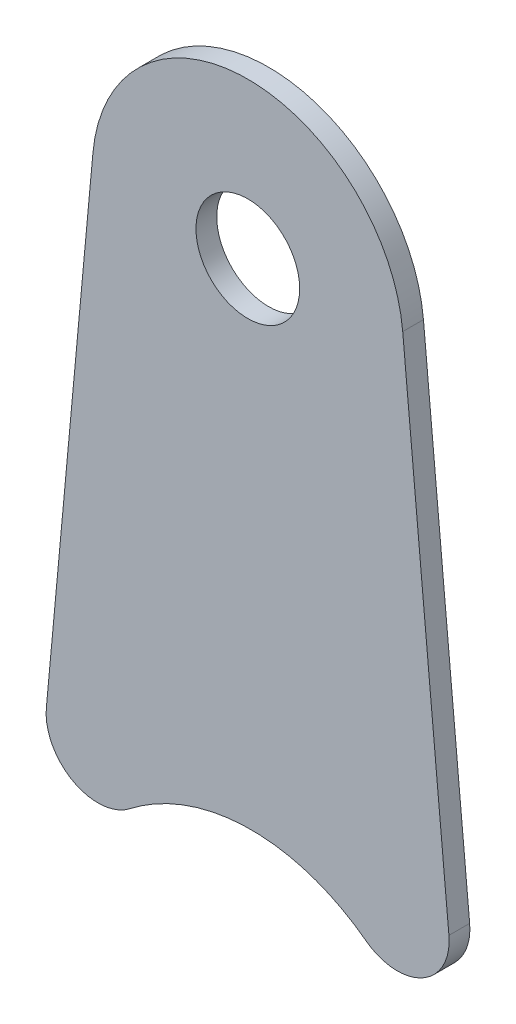
ISO-10303-21;
HEADER;
FILE_DESCRIPTION(('STEP AP214'),'2;1');
FILE_NAME('part.step','',(''),(''),'','','');
FILE_SCHEMA(('AUTOMOTIVE_DESIGN { 1 0 10303 214 1 1 1 1 }'));
ENDSEC;
DATA;
#1=APPLICATION_CONTEXT('core data for automotive mechanical design processes');
#2=APPLICATION_PROTOCOL_DEFINITION('international standard','automotive_design',2000,#1);
#3=PRODUCT_CONTEXT('',#1,'mechanical');
#4=PRODUCT('Part','Part','',(#3));
#5=PRODUCT_RELATED_PRODUCT_CATEGORY('part','',(#4));
#6=PRODUCT_DEFINITION_FORMATION('','',#4);
#7=PRODUCT_DEFINITION_CONTEXT('part definition',#1,'design');
#8=PRODUCT_DEFINITION('design','',#6,#7);
#9=PRODUCT_DEFINITION_SHAPE('','',#8);
#10=(LENGTH_UNIT() NAMED_UNIT(*) SI_UNIT(.MILLI.,.METRE.));
#11=(NAMED_UNIT(*) PLANE_ANGLE_UNIT() SI_UNIT($,.RADIAN.));
#12=(NAMED_UNIT(*) SI_UNIT($,.STERADIAN.) SOLID_ANGLE_UNIT());
#13=UNCERTAINTY_MEASURE_WITH_UNIT(LENGTH_MEASURE(1.E-05),#10,'distance_accuracy_value','');
#14=(GEOMETRIC_REPRESENTATION_CONTEXT(3) GLOBAL_UNCERTAINTY_ASSIGNED_CONTEXT((#13)) GLOBAL_UNIT_ASSIGNED_CONTEXT((#10,
#11,#12)) REPRESENTATION_CONTEXT('',''));
#15=CARTESIAN_POINT('',(0.,0.,0.));
#16=DIRECTION('',(0.,0.,1.));
#17=DIRECTION('',(1.,0.,0.));
#18=AXIS2_PLACEMENT_3D('',#15,#16,#17);
#19=CARTESIAN_POINT('',(0.,0.,0.635));
#20=DIRECTION('',(0.,0.,1.));
#21=DIRECTION('',(1.,0.,0.));
#22=AXIS2_PLACEMENT_3D('',#19,#20,#21);
#23=PLANE('',#22);
#24=CARTESIAN_POINT('',(0.,0.,0.635));
#25=DIRECTION('',(0.,0.,1.));
#26=DIRECTION('',(1.,0.,0.));
#27=AXIS2_PLACEMENT_3D('',#24,#25,#26);
#28=CIRCLE('',#27,3.175);
#29=CARTESIAN_POINT('',(3.175,0.,0.635));
#30=VERTEX_POINT('',#29);
#31=EDGE_CURVE('E197',#30,#30,#28,.T.);
#32=ORIENTED_EDGE('',*,*,#31,.F.);
#33=EDGE_LOOP('',(#32));
#34=FACE_BOUND('',#33,.T.);
#35=CARTESIAN_POINT('',(-0.0735883476750668,-44.1888762486438,0.635));
#36=DIRECTION('',(0.,0.,1.));
#37=DIRECTION('',(-0.111014221915737,-0.993818817759275,0.));
#38=AXIS2_PLACEMENT_3D('',#35,#36,#37);
#39=ELLIPSE('',#38,14.0258719552537,12.7);
#40=CARTESIAN_POINT('',(-7.23241504955875,-32.7851017526122,0.635));
#41=VERTEX_POINT('',#40);
#42=CARTESIAN_POINT('',(7.24595304893006,-32.5576749265585,0.635));
#43=VERTEX_POINT('',#42);
#44=EDGE_CURVE('E134',#41,#43,#39,.F.);
#45=ORIENTED_EDGE('',*,*,#44,.T.);
#46=CARTESIAN_POINT('',(9.15263991255986,-30.0189409499352,0.635));
#47=DIRECTION('',(0.,0.,-1.));
#48=DIRECTION('',(1.,0.,0.));
#49=AXIS2_PLACEMENT_3D('',#46,#47,#48);
#50=CIRCLE('',#49,3.175);
#51=CARTESIAN_POINT('',(12.3141549737306,-29.726626875709,0.635));
#52=VERTEX_POINT('',#51);
#53=EDGE_CURVE('E66',#52,#43,#50,.T.);
#54=ORIENTED_EDGE('',*,*,#53,.F.);
#55=DIRECTION('',(-0.0920674249531236,0.99575277517188,0.));
#56=VECTOR('',#55,1.);
#57=CARTESIAN_POINT('',(12.7,-33.8997234501994,0.635));
#58=LINE('',#57,#56);
#59=CARTESIAN_POINT('',(9.48454518351216,0.876942222678502,0.635));
#60=VERTEX_POINT('',#59);
#61=EDGE_CURVE('E193',#52,#60,#58,.T.);
#62=ORIENTED_EDGE('',*,*,#61,.T.);
#63=CARTESIAN_POINT('',(0.,0.,0.635));
#64=DIRECTION('',(0.,0.,1.));
#65=DIRECTION('',(1.,0.,0.));
#66=AXIS2_PLACEMENT_3D('',#63,#64,#65);
#67=CIRCLE('',#66,9.525);
#68=CARTESIAN_POINT('',(-9.48454518351216,0.876942222678502,0.635));
#69=VERTEX_POINT('',#68);
#70=EDGE_CURVE('E153',#60,#69,#67,.T.);
#71=ORIENTED_EDGE('',*,*,#70,.T.);
#72=DIRECTION('',(-0.0920674249531236,-0.99575277517188,0.));
#73=VECTOR('',#72,1.);
#74=CARTESIAN_POINT('',(-9.48454518351216,0.876942222678502,0.635));
#75=LINE('',#74,#73);
#76=CARTESIAN_POINT('',(-12.337805101035,-29.9824141958013,0.635));
#77=VERTEX_POINT('',#76);
#78=EDGE_CURVE('E185',#69,#77,#75,.T.);
#79=ORIENTED_EDGE('',*,*,#78,.T.);
#80=CARTESIAN_POINT('',(-9.17629003986427,-30.2747282700274,0.635));
#81=DIRECTION('',(0.,0.,-1.));
#82=DIRECTION('',(1.,0.,0.));
#83=AXIS2_PLACEMENT_3D('',#80,#81,#82);
#84=CIRCLE('',#83,3.17500000000002);
#85=EDGE_CURVE('E120',#41,#77,#84,.T.);
#86=ORIENTED_EDGE('',*,*,#85,.F.);
#87=EDGE_LOOP('',(#45,#54,#62,#71,#79,#86));
#88=FACE_BOUND('',#87,.T.);
#89=ADVANCED_FACE('F45',(#34,#88),#23,.T.);
#90=CARTESIAN_POINT('',(0.,0.,-0.635));
#91=DIRECTION('',(0.,0.,1.));
#92=DIRECTION('',(1.,0.,0.));
#93=AXIS2_PLACEMENT_3D('',#90,#91,#92);
#94=PLANE('',#93);
#95=CARTESIAN_POINT('',(0.,0.,-0.635));
#96=DIRECTION('',(0.,0.,1.));
#97=DIRECTION('',(1.,0.,0.));
#98=AXIS2_PLACEMENT_3D('',#95,#96,#97);
#99=CIRCLE('',#98,3.175);
#100=CARTESIAN_POINT('',(3.175,0.,-0.635));
#101=VERTEX_POINT('',#100);
#102=EDGE_CURVE('E200',#101,#101,#99,.T.);
#103=ORIENTED_EDGE('',*,*,#102,.T.);
#104=EDGE_LOOP('',(#103));
#105=FACE_BOUND('',#104,.T.);
#106=CARTESIAN_POINT('',(9.15263991255986,-30.0189409499352,-0.635));
#107=DIRECTION('',(0.,0.,-1.));
#108=DIRECTION('',(-1.,0.,0.));
#109=AXIS2_PLACEMENT_3D('',#106,#107,#108);
#110=CIRCLE('',#109,3.175);
#111=CARTESIAN_POINT('',(12.3141549737306,-29.726626875709,-0.635));
#112=VERTEX_POINT('',#111);
#113=CARTESIAN_POINT('',(7.24595304893007,-32.5576749265585,-0.635));
#114=VERTEX_POINT('',#113);
#115=EDGE_CURVE('E113',#112,#114,#110,.T.);
#116=ORIENTED_EDGE('',*,*,#115,.T.);
#117=CARTESIAN_POINT('',(-0.0735883476750668,-44.1888762486438,-0.635));
#118=DIRECTION('',(0.,0.,1.));
#119=DIRECTION('',(-0.111014221915737,-0.993818817759275,0.));
#120=AXIS2_PLACEMENT_3D('',#117,#118,#119);
#121=ELLIPSE('',#120,14.0258719552537,12.7);
#122=CARTESIAN_POINT('',(-7.23241504955874,-32.7851017526122,-0.635));
#123=VERTEX_POINT('',#122);
#124=EDGE_CURVE('E127',#123,#114,#121,.F.);
#125=ORIENTED_EDGE('',*,*,#124,.F.);
#126=CARTESIAN_POINT('',(-9.17629003986427,-30.2747282700274,-0.635));
#127=DIRECTION('',(0.,0.,-1.));
#128=DIRECTION('',(-1.,0.,0.));
#129=AXIS2_PLACEMENT_3D('',#126,#127,#128);
#130=CIRCLE('',#129,3.17500000000002);
#131=CARTESIAN_POINT('',(-12.337805101035,-29.9824141958013,-0.635));
#132=VERTEX_POINT('',#131);
#133=EDGE_CURVE('E77',#123,#132,#130,.T.);
#134=ORIENTED_EDGE('',*,*,#133,.T.);
#135=DIRECTION('',(-0.0920674249531236,-0.99575277517188,0.));
#136=VECTOR('',#135,1.);
#137=CARTESIAN_POINT('',(-9.48454518351216,0.876942222678502,-0.635));
#138=LINE('',#137,#136);
#139=CARTESIAN_POINT('',(-9.48454518351216,0.876942222678502,-0.635));
#140=VERTEX_POINT('',#139);
#141=EDGE_CURVE('E187',#140,#132,#138,.T.);
#142=ORIENTED_EDGE('',*,*,#141,.F.);
#143=CARTESIAN_POINT('',(0.,0.,-0.635));
#144=DIRECTION('',(0.,0.,1.));
#145=DIRECTION('',(1.,0.,0.));
#146=AXIS2_PLACEMENT_3D('',#143,#144,#145);
#147=CIRCLE('',#146,9.525);
#148=CARTESIAN_POINT('',(9.48454518351216,0.876942222678502,-0.635));
#149=VERTEX_POINT('',#148);
#150=EDGE_CURVE('E140',#149,#140,#147,.T.);
#151=ORIENTED_EDGE('',*,*,#150,.F.);
#152=DIRECTION('',(-0.0920674249531236,0.99575277517188,0.));
#153=VECTOR('',#152,1.);
#154=CARTESIAN_POINT('',(12.7,-33.8997234501994,-0.635));
#155=LINE('',#154,#153);
#156=EDGE_CURVE('E129',#112,#149,#155,.T.);
#157=ORIENTED_EDGE('',*,*,#156,.F.);
#158=EDGE_LOOP('',(#116,#125,#134,#142,#151,#157));
#159=FACE_BOUND('',#158,.T.);
#160=ADVANCED_FACE('F126',(#105,#159),#94,.F.);
#161=CARTESIAN_POINT('',(12.7,-33.8997234501994,0.635));
#162=DIRECTION('',(0.99575277517188,0.0920674249531236,0.));
#163=DIRECTION('',(-0.0920674249531236,0.99575277517188,0.));
#164=AXIS2_PLACEMENT_3D('',#161,#162,#163);
#165=PLANE('',#164);
#166=ORIENTED_EDGE('',*,*,#61,.F.);
#167=DIRECTION('',(0.,0.,1.));
#168=VECTOR('',#167,1.);
#169=CARTESIAN_POINT('',(12.3141549737306,-29.726626875709,0.635));
#170=LINE('',#169,#168);
#171=EDGE_CURVE('E121',#52,#112,#170,.F.);
#172=ORIENTED_EDGE('',*,*,#171,.T.);
#173=ORIENTED_EDGE('',*,*,#156,.T.);
#174=DIRECTION('',(0.,0.,1.));
#175=VECTOR('',#174,1.);
#176=CARTESIAN_POINT('',(9.48454518351216,0.876942222678502,0.635));
#177=LINE('',#176,#175);
#178=EDGE_CURVE('E11',#149,#60,#177,.T.);
#179=ORIENTED_EDGE('',*,*,#178,.T.);
#180=EDGE_LOOP('',(#166,#172,#173,#179));
#181=FACE_BOUND('',#180,.T.);
#182=ADVANCED_FACE('F160',(#181),#165,.T.);
#183=CARTESIAN_POINT('',(-0.0735883476750668,-44.1888762486438,-0.635));
#184=DIRECTION('',(0.,0.,1.));
#185=DIRECTION('',(-0.111014221915737,-0.993818817759275,0.));
#186=AXIS2_PLACEMENT_3D('',#183,#184,#185);
#187=ELLIPSE('',#186,14.0258719552537,12.7);
#188=DIRECTION('',(0.,0.,1.));
#189=VECTOR('',#188,1.);
#190=SURFACE_OF_LINEAR_EXTRUSION('',#187,#189);
#191=ORIENTED_EDGE('',*,*,#124,.T.);
#192=DIRECTION('',(0.,0.,1.));
#193=VECTOR('',#192,1.);
#194=CARTESIAN_POINT('',(7.24595304893007,-32.5576749265585,0.635));
#195=LINE('',#194,#193);
#196=EDGE_CURVE('E110',#43,#114,#195,.F.);
#197=ORIENTED_EDGE('',*,*,#196,.F.);
#198=ORIENTED_EDGE('',*,*,#44,.F.);
#199=DIRECTION('',(0.,0.,1.));
#200=VECTOR('',#199,1.);
#201=CARTESIAN_POINT('',(-7.23241504955875,-32.7851017526122,0.635));
#202=LINE('',#201,#200);
#203=EDGE_CURVE('E132',#41,#123,#202,.F.);
#204=ORIENTED_EDGE('',*,*,#203,.T.);
#205=EDGE_LOOP('',(#191,#197,#198,#204));
#206=FACE_BOUND('',#205,.T.);
#207=ADVANCED_FACE('F131',(#206),#190,.F.);
#208=CARTESIAN_POINT('',(0.,0.,0.635));
#209=DIRECTION('',(0.,0.,1.));
#210=DIRECTION('',(1.,0.,0.));
#211=AXIS2_PLACEMENT_3D('',#208,#209,#210);
#212=CYLINDRICAL_SURFACE('',#211,9.525);
#213=ORIENTED_EDGE('',*,*,#178,.F.);
#214=ORIENTED_EDGE('',*,*,#150,.T.);
#215=DIRECTION('',(0.,0.,1.));
#216=VECTOR('',#215,1.);
#217=CARTESIAN_POINT('',(-9.48454518351216,0.876942222678502,0.635));
#218=LINE('',#217,#216);
#219=EDGE_CURVE('E55',#140,#69,#218,.T.);
#220=ORIENTED_EDGE('',*,*,#219,.T.);
#221=ORIENTED_EDGE('',*,*,#70,.F.);
#222=EDGE_LOOP('',(#213,#214,#220,#221));
#223=FACE_BOUND('',#222,.T.);
#224=ADVANCED_FACE('F159',(#223),#212,.T.);
#225=CARTESIAN_POINT('',(-9.48454518351216,0.876942222678502,0.635));
#226=DIRECTION('',(-0.99575277517188,0.0920674249531236,0.));
#227=DIRECTION('',(-0.0920674249531236,-0.99575277517188,0.));
#228=AXIS2_PLACEMENT_3D('',#225,#226,#227);
#229=PLANE('',#228);
#230=DIRECTION('',(0.,0.,1.));
#231=VECTOR('',#230,1.);
#232=CARTESIAN_POINT('',(-12.337805101035,-29.9824141958013,0.635));
#233=LINE('',#232,#231);
#234=EDGE_CURVE('E135',#77,#132,#233,.F.);
#235=ORIENTED_EDGE('',*,*,#234,.F.);
#236=ORIENTED_EDGE('',*,*,#78,.F.);
#237=ORIENTED_EDGE('',*,*,#219,.F.);
#238=ORIENTED_EDGE('',*,*,#141,.T.);
#239=EDGE_LOOP('',(#235,#236,#237,#238));
#240=FACE_BOUND('',#239,.T.);
#241=ADVANCED_FACE('F171',(#240),#229,.T.);
#242=CARTESIAN_POINT('',(0.,0.,0.635));
#243=DIRECTION('',(0.,0.,1.));
#244=DIRECTION('',(1.,0.,0.));
#245=AXIS2_PLACEMENT_3D('',#242,#243,#244);
#246=CYLINDRICAL_SURFACE('',#245,3.175);
#247=ORIENTED_EDGE('',*,*,#31,.T.);
#248=EDGE_LOOP('',(#247));
#249=FACE_BOUND('',#248,.T.);
#250=ORIENTED_EDGE('',*,*,#102,.F.);
#251=EDGE_LOOP('',(#250));
#252=FACE_BOUND('',#251,.T.);
#253=ADVANCED_FACE('F47',(#249,#252),#246,.F.);
#254=CARTESIAN_POINT('',(-9.17629003986427,-30.2747282700274,0.635));
#255=DIRECTION('',(0.,0.,-1.));
#256=DIRECTION('',(-1.,0.,0.));
#257=AXIS2_PLACEMENT_3D('',#254,#255,#256);
#258=CYLINDRICAL_SURFACE('',#257,3.17500000000002);
#259=ORIENTED_EDGE('',*,*,#85,.T.);
#260=ORIENTED_EDGE('',*,*,#234,.T.);
#261=ORIENTED_EDGE('',*,*,#133,.F.);
#262=ORIENTED_EDGE('',*,*,#203,.F.);
#263=EDGE_LOOP('',(#259,#260,#261,#262));
#264=FACE_BOUND('',#263,.T.);
#265=ADVANCED_FACE('F161',(#264),#258,.T.);
#266=CARTESIAN_POINT('',(9.15263991255986,-30.0189409499352,0.635));
#267=DIRECTION('',(0.,0.,-1.));
#268=DIRECTION('',(-1.,0.,0.));
#269=AXIS2_PLACEMENT_3D('',#266,#267,#268);
#270=CYLINDRICAL_SURFACE('',#269,3.175);
#271=ORIENTED_EDGE('',*,*,#53,.T.);
#272=ORIENTED_EDGE('',*,*,#196,.T.);
#273=ORIENTED_EDGE('',*,*,#115,.F.);
#274=ORIENTED_EDGE('',*,*,#171,.F.);
#275=EDGE_LOOP('',(#271,#272,#273,#274));
#276=FACE_BOUND('',#275,.T.);
#277=ADVANCED_FACE('F112',(#276),#270,.T.);
#278=CLOSED_SHELL('',(#89,#160,#182,#207,#224,#241,#253,#265,#277));
#279=MANIFOLD_SOLID_BREP('B2',#278);
#280=ADVANCED_BREP_SHAPE_REPRESENTATION('',(#18,#279),#14);
#281=SHAPE_DEFINITION_REPRESENTATION(#9,#280);
ENDSEC;
END-ISO-10303-21;
